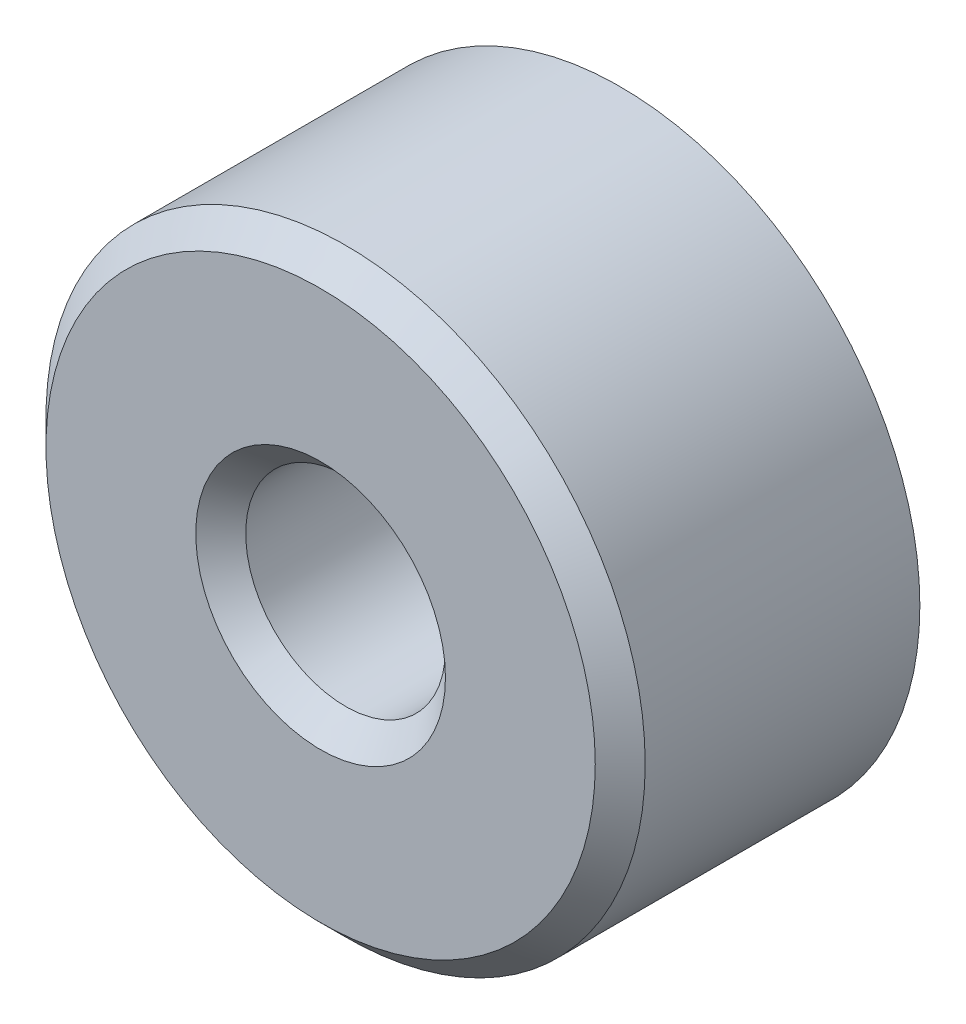
ISO-10303-21;
HEADER;
FILE_DESCRIPTION(('STEP AP214'),'2;1');
FILE_NAME('part.step','',(''),(''),'','','');
FILE_SCHEMA(('AUTOMOTIVE_DESIGN { 1 0 10303 214 1 1 1 1 }'));
ENDSEC;
DATA;
#1=APPLICATION_CONTEXT('core data for automotive mechanical design processes');
#2=APPLICATION_PROTOCOL_DEFINITION('international standard','automotive_design',2000,#1);
#3=PRODUCT_CONTEXT('',#1,'mechanical');
#4=PRODUCT('Part','Part','',(#3));
#5=PRODUCT_RELATED_PRODUCT_CATEGORY('part','',(#4));
#6=PRODUCT_DEFINITION_FORMATION('','',#4);
#7=PRODUCT_DEFINITION_CONTEXT('part definition',#1,'design');
#8=PRODUCT_DEFINITION('design','',#6,#7);
#9=PRODUCT_DEFINITION_SHAPE('','',#8);
#10=(LENGTH_UNIT() NAMED_UNIT(*) SI_UNIT(.MILLI.,.METRE.));
#11=(NAMED_UNIT(*) PLANE_ANGLE_UNIT() SI_UNIT($,.RADIAN.));
#12=(NAMED_UNIT(*) SI_UNIT($,.STERADIAN.) SOLID_ANGLE_UNIT());
#13=UNCERTAINTY_MEASURE_WITH_UNIT(LENGTH_MEASURE(1.E-05),#10,'distance_accuracy_value','');
#14=(GEOMETRIC_REPRESENTATION_CONTEXT(3) GLOBAL_UNCERTAINTY_ASSIGNED_CONTEXT((#13)) GLOBAL_UNIT_ASSIGNED_CONTEXT((#10,
#11,#12)) REPRESENTATION_CONTEXT('',''));
#15=CARTESIAN_POINT('',(0.,0.,0.));
#16=DIRECTION('',(0.,0.,1.));
#17=DIRECTION('',(1.,0.,0.));
#18=AXIS2_PLACEMENT_3D('',#15,#16,#17);
#19=CARTESIAN_POINT('',(0.,0.,3.));
#20=DIRECTION('',(0.,0.,1.));
#21=DIRECTION('',(1.,0.,0.));
#22=AXIS2_PLACEMENT_3D('',#19,#20,#21);
#23=PLANE('',#22);
#24=CARTESIAN_POINT('',(0.,0.,3.));
#25=DIRECTION('',(0.,0.,1.));
#26=DIRECTION('',(1.,0.,0.));
#27=AXIS2_PLACEMENT_3D('',#24,#25,#26);
#28=CIRCLE('',#27,1.25);
#29=CARTESIAN_POINT('',(1.25,0.,3.));
#30=VERTEX_POINT('',#29);
#31=EDGE_CURVE('E11',#30,#30,#28,.F.);
#32=ORIENTED_EDGE('',*,*,#31,.T.);
#33=EDGE_LOOP('',(#32));
#34=FACE_BOUND('',#33,.T.);
#35=CARTESIAN_POINT('',(0.,0.,3.));
#36=DIRECTION('',(0.,0.,1.));
#37=DIRECTION('',(1.,0.,0.));
#38=AXIS2_PLACEMENT_3D('',#35,#36,#37);
#39=CIRCLE('',#38,2.75);
#40=CARTESIAN_POINT('',(2.75,0.,3.));
#41=VERTEX_POINT('',#40);
#42=EDGE_CURVE('E53',#41,#41,#39,.T.);
#43=ORIENTED_EDGE('',*,*,#42,.T.);
#44=EDGE_LOOP('',(#43));
#45=FACE_BOUND('',#44,.T.);
#46=ADVANCED_FACE('F38',(#34,#45),#23,.T.);
#47=CARTESIAN_POINT('',(0.,0.,0.));
#48=DIRECTION('',(0.,0.,1.));
#49=DIRECTION('',(1.,0.,0.));
#50=AXIS2_PLACEMENT_3D('',#47,#48,#49);
#51=PLANE('',#50);
#52=CARTESIAN_POINT('',(0.,0.,0.));
#53=DIRECTION('',(0.,0.,1.));
#54=DIRECTION('',(1.,0.,0.));
#55=AXIS2_PLACEMENT_3D('',#52,#53,#54);
#56=CIRCLE('',#55,3.);
#57=CARTESIAN_POINT('',(3.,0.,0.));
#58=VERTEX_POINT('',#57);
#59=EDGE_CURVE('E58',#58,#58,#56,.T.);
#60=ORIENTED_EDGE('',*,*,#59,.F.);
#61=EDGE_LOOP('',(#60));
#62=FACE_BOUND('',#61,.T.);
#63=CARTESIAN_POINT('',(0.,0.,0.));
#64=DIRECTION('',(0.,0.,1.));
#65=DIRECTION('',(1.,0.,0.));
#66=AXIS2_PLACEMENT_3D('',#63,#64,#65);
#67=CIRCLE('',#66,1.);
#68=CARTESIAN_POINT('',(1.,0.,0.));
#69=VERTEX_POINT('',#68);
#70=EDGE_CURVE('E61',#69,#69,#67,.T.);
#71=ORIENTED_EDGE('',*,*,#70,.T.);
#72=EDGE_LOOP('',(#71));
#73=FACE_BOUND('',#72,.T.);
#74=ADVANCED_FACE('F65',(#62,#73),#51,.F.);
#75=CARTESIAN_POINT('',(0.,0.,3.));
#76=DIRECTION('',(0.,0.,-1.));
#77=DIRECTION('',(-1.,0.,0.));
#78=AXIS2_PLACEMENT_3D('',#75,#76,#77);
#79=CYLINDRICAL_SURFACE('',#78,3.);
#80=CARTESIAN_POINT('',(0.,0.,2.75));
#81=DIRECTION('',(0.,0.,1.));
#82=DIRECTION('',(1.,0.,0.));
#83=AXIS2_PLACEMENT_3D('',#80,#81,#82);
#84=CIRCLE('',#83,3.);
#85=CARTESIAN_POINT('',(3.,0.,2.75));
#86=VERTEX_POINT('',#85);
#87=EDGE_CURVE('E49',#86,#86,#84,.F.);
#88=ORIENTED_EDGE('',*,*,#87,.T.);
#89=EDGE_LOOP('',(#88));
#90=FACE_BOUND('',#89,.T.);
#91=ORIENTED_EDGE('',*,*,#59,.T.);
#92=EDGE_LOOP('',(#91));
#93=FACE_BOUND('',#92,.T.);
#94=ADVANCED_FACE('F70',(#90,#93),#79,.T.);
#95=CARTESIAN_POINT('',(0.,0.,3.));
#96=DIRECTION('',(0.,0.,-1.));
#97=DIRECTION('',(-1.,0.,0.));
#98=AXIS2_PLACEMENT_3D('',#95,#96,#97);
#99=CYLINDRICAL_SURFACE('',#98,1.);
#100=CARTESIAN_POINT('',(0.,0.,2.75));
#101=DIRECTION('',(0.,0.,1.));
#102=DIRECTION('',(1.,0.,0.));
#103=AXIS2_PLACEMENT_3D('',#100,#101,#102);
#104=CIRCLE('',#103,1.);
#105=CARTESIAN_POINT('',(1.,0.,2.75));
#106=VERTEX_POINT('',#105);
#107=EDGE_CURVE('E45',#106,#106,#104,.T.);
#108=ORIENTED_EDGE('',*,*,#107,.T.);
#109=EDGE_LOOP('',(#108));
#110=FACE_BOUND('',#109,.T.);
#111=ORIENTED_EDGE('',*,*,#70,.F.);
#112=EDGE_LOOP('',(#111));
#113=FACE_BOUND('',#112,.T.);
#114=ADVANCED_FACE('F67',(#110,#113),#99,.F.);
#115=CARTESIAN_POINT('',(0.,0.,3.));
#116=DIRECTION('',(0.,0.,-1.));
#117=DIRECTION('',(-1.,0.,0.));
#118=AXIS2_PLACEMENT_3D('',#115,#116,#117);
#119=CONICAL_SURFACE('',#118,2.75,0.785398163397447);
#120=ORIENTED_EDGE('',*,*,#87,.F.);
#121=EDGE_LOOP('',(#120));
#122=FACE_BOUND('',#121,.T.);
#123=ORIENTED_EDGE('',*,*,#42,.F.);
#124=EDGE_LOOP('',(#123));
#125=FACE_BOUND('',#124,.T.);
#126=ADVANCED_FACE('F69',(#122,#125),#119,.T.);
#127=CARTESIAN_POINT('',(0.,0.,2.75));
#128=DIRECTION('',(0.,0.,1.));
#129=DIRECTION('',(1.,0.,0.));
#130=AXIS2_PLACEMENT_3D('',#127,#128,#129);
#131=CONICAL_SURFACE('',#130,1.,0.78539816339745);
#132=ORIENTED_EDGE('',*,*,#31,.F.);
#133=EDGE_LOOP('',(#132));
#134=FACE_BOUND('',#133,.T.);
#135=ORIENTED_EDGE('',*,*,#107,.F.);
#136=EDGE_LOOP('',(#135));
#137=FACE_BOUND('',#136,.T.);
#138=ADVANCED_FACE('F40',(#134,#137),#131,.F.);
#139=CLOSED_SHELL('',(#46,#74,#94,#114,#126,#138));
#140=MANIFOLD_SOLID_BREP('B2',#139);
#141=ADVANCED_BREP_SHAPE_REPRESENTATION('',(#18,#140),#14);
#142=SHAPE_DEFINITION_REPRESENTATION(#9,#141);
ENDSEC;
END-ISO-10303-21;
